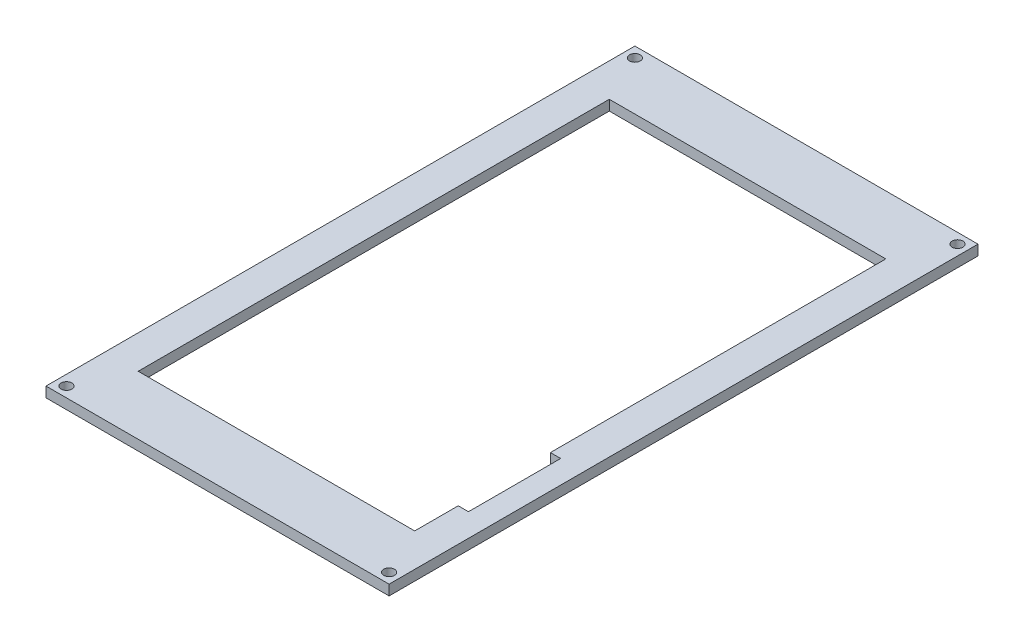
ISO-10303-21;
HEADER;
FILE_DESCRIPTION(('STEP AP214'),'2;1');
FILE_NAME('part.step','',(''),(''),'','','');
FILE_SCHEMA(('AUTOMOTIVE_DESIGN { 1 0 10303 214 1 1 1 1 }'));
ENDSEC;
DATA;
#1=APPLICATION_CONTEXT('core data for automotive mechanical design processes');
#2=APPLICATION_PROTOCOL_DEFINITION('international standard','automotive_design',2000,#1);
#3=PRODUCT_CONTEXT('',#1,'mechanical');
#4=PRODUCT('Part','Part','',(#3));
#5=PRODUCT_RELATED_PRODUCT_CATEGORY('part','',(#4));
#6=PRODUCT_DEFINITION_FORMATION('','',#4);
#7=PRODUCT_DEFINITION_CONTEXT('part definition',#1,'design');
#8=PRODUCT_DEFINITION('design','',#6,#7);
#9=PRODUCT_DEFINITION_SHAPE('','',#8);
#10=(LENGTH_UNIT() NAMED_UNIT(*) SI_UNIT(.MILLI.,.METRE.));
#11=(NAMED_UNIT(*) PLANE_ANGLE_UNIT() SI_UNIT($,.RADIAN.));
#12=(NAMED_UNIT(*) SI_UNIT($,.STERADIAN.) SOLID_ANGLE_UNIT());
#13=UNCERTAINTY_MEASURE_WITH_UNIT(LENGTH_MEASURE(1.E-05),#10,'distance_accuracy_value','');
#14=(GEOMETRIC_REPRESENTATION_CONTEXT(3) GLOBAL_UNCERTAINTY_ASSIGNED_CONTEXT((#13)) GLOBAL_UNIT_ASSIGNED_CONTEXT((#10,
#11,#12)) REPRESENTATION_CONTEXT('',''));
#15=CARTESIAN_POINT('',(0.,0.,0.));
#16=DIRECTION('',(0.,0.,1.));
#17=DIRECTION('',(1.,0.,0.));
#18=AXIS2_PLACEMENT_3D('',#15,#16,#17);
#19=CARTESIAN_POINT('',(67.,2.,0.));
#20=DIRECTION('',(1.,0.,0.));
#21=DIRECTION('',(0.,0.,-1.));
#22=AXIS2_PLACEMENT_3D('',#19,#20,#21);
#23=PLANE('',#22);
#24=DIRECTION('',(0.,0.,1.));
#25=VECTOR('',#24,1.);
#26=CARTESIAN_POINT('',(67.,0.,0.));
#27=LINE('',#26,#25);
#28=CARTESIAN_POINT('',(67.,0.,0.));
#29=VERTEX_POINT('',#28);
#30=CARTESIAN_POINT('',(67.,0.,115.));
#31=VERTEX_POINT('',#30);
#32=EDGE_CURVE('E216',#29,#31,#27,.T.);
#33=ORIENTED_EDGE('',*,*,#32,.F.);
#34=DIRECTION('',(0.,-1.,0.));
#35=VECTOR('',#34,1.);
#36=CARTESIAN_POINT('',(67.,2.,0.));
#37=LINE('',#36,#35);
#38=CARTESIAN_POINT('',(67.,2.,0.));
#39=VERTEX_POINT('',#38);
#40=EDGE_CURVE('E11',#39,#29,#37,.T.);
#41=ORIENTED_EDGE('',*,*,#40,.F.);
#42=DIRECTION('',(0.,0.,1.));
#43=VECTOR('',#42,1.);
#44=CARTESIAN_POINT('',(67.,2.,0.));
#45=LINE('',#44,#43);
#46=CARTESIAN_POINT('',(67.,2.,115.));
#47=VERTEX_POINT('',#46);
#48=EDGE_CURVE('E160',#39,#47,#45,.T.);
#49=ORIENTED_EDGE('',*,*,#48,.T.);
#50=DIRECTION('',(0.,-1.,0.));
#51=VECTOR('',#50,1.);
#52=CARTESIAN_POINT('',(67.,2.,115.));
#53=LINE('',#52,#51);
#54=EDGE_CURVE('E108',#47,#31,#53,.T.);
#55=ORIENTED_EDGE('',*,*,#54,.T.);
#56=EDGE_LOOP('',(#33,#41,#49,#55));
#57=FACE_BOUND('',#56,.T.);
#58=ADVANCED_FACE('F41',(#57),#23,.T.);
#59=CARTESIAN_POINT('',(0.,2.,0.));
#60=DIRECTION('',(0.,0.,-1.));
#61=DIRECTION('',(-1.,0.,0.));
#62=AXIS2_PLACEMENT_3D('',#59,#60,#61);
#63=PLANE('',#62);
#64=DIRECTION('',(1.,0.,0.));
#65=VECTOR('',#64,1.);
#66=CARTESIAN_POINT('',(0.,0.,0.));
#67=LINE('',#66,#65);
#68=CARTESIAN_POINT('',(0.,0.,0.));
#69=VERTEX_POINT('',#68);
#70=EDGE_CURVE('E148',#69,#29,#67,.T.);
#71=ORIENTED_EDGE('',*,*,#70,.F.);
#72=DIRECTION('',(0.,-1.,0.));
#73=VECTOR('',#72,1.);
#74=CARTESIAN_POINT('',(0.,2.,0.));
#75=LINE('',#74,#73);
#76=CARTESIAN_POINT('',(0.,2.,0.));
#77=VERTEX_POINT('',#76);
#78=EDGE_CURVE('E52',#77,#69,#75,.T.);
#79=ORIENTED_EDGE('',*,*,#78,.F.);
#80=DIRECTION('',(1.,0.,0.));
#81=VECTOR('',#80,1.);
#82=CARTESIAN_POINT('',(0.,2.,0.));
#83=LINE('',#82,#81);
#84=EDGE_CURVE('E146',#77,#39,#83,.T.);
#85=ORIENTED_EDGE('',*,*,#84,.T.);
#86=ORIENTED_EDGE('',*,*,#40,.T.);
#87=EDGE_LOOP('',(#71,#79,#85,#86));
#88=FACE_BOUND('',#87,.T.);
#89=ADVANCED_FACE('F144',(#88),#63,.T.);
#90=CARTESIAN_POINT('',(0.,2.,0.));
#91=DIRECTION('',(1.,0.,0.));
#92=DIRECTION('',(0.,0.,-1.));
#93=AXIS2_PLACEMENT_3D('',#90,#91,#92);
#94=PLANE('',#93);
#95=DIRECTION('',(0.,0.,1.));
#96=VECTOR('',#95,1.);
#97=CARTESIAN_POINT('',(0.,0.,0.));
#98=LINE('',#97,#96);
#99=CARTESIAN_POINT('',(0.,0.,115.));
#100=VERTEX_POINT('',#99);
#101=EDGE_CURVE('E221',#69,#100,#98,.T.);
#102=ORIENTED_EDGE('',*,*,#101,.T.);
#103=DIRECTION('',(0.,-1.,0.));
#104=VECTOR('',#103,1.);
#105=CARTESIAN_POINT('',(0.,2.,115.));
#106=LINE('',#105,#104);
#107=CARTESIAN_POINT('',(0.,2.,115.));
#108=VERTEX_POINT('',#107);
#109=EDGE_CURVE('E152',#108,#100,#106,.T.);
#110=ORIENTED_EDGE('',*,*,#109,.F.);
#111=DIRECTION('',(0.,0.,1.));
#112=VECTOR('',#111,1.);
#113=CARTESIAN_POINT('',(0.,2.,0.));
#114=LINE('',#113,#112);
#115=EDGE_CURVE('E155',#77,#108,#114,.T.);
#116=ORIENTED_EDGE('',*,*,#115,.F.);
#117=ORIENTED_EDGE('',*,*,#78,.T.);
#118=EDGE_LOOP('',(#102,#110,#116,#117));
#119=FACE_BOUND('',#118,.T.);
#120=ADVANCED_FACE('F156',(#119),#94,.F.);
#121=CARTESIAN_POINT('',(62.5,2.,0.));
#122=DIRECTION('',(-1.,0.,0.));
#123=DIRECTION('',(0.,0.,1.));
#124=AXIS2_PLACEMENT_3D('',#121,#122,#123);
#125=PLANE('',#124);
#126=DIRECTION('',(0.,0.,-1.));
#127=VECTOR('',#126,1.);
#128=CARTESIAN_POINT('',(62.5,0.,0.));
#129=LINE('',#128,#127);
#130=CARTESIAN_POINT('',(62.5,0.,95.));
#131=VERTEX_POINT('',#130);
#132=CARTESIAN_POINT('',(62.5,0.,77.));
#133=VERTEX_POINT('',#132);
#134=EDGE_CURVE('E187',#131,#133,#129,.T.);
#135=ORIENTED_EDGE('',*,*,#134,.F.);
#136=DIRECTION('',(0.,-1.,0.));
#137=VECTOR('',#136,1.);
#138=CARTESIAN_POINT('',(62.5,2.,95.));
#139=LINE('',#138,#137);
#140=CARTESIAN_POINT('',(62.5,2.,95.));
#141=VERTEX_POINT('',#140);
#142=EDGE_CURVE('E45',#141,#131,#139,.T.);
#143=ORIENTED_EDGE('',*,*,#142,.F.);
#144=DIRECTION('',(0.,0.,-1.));
#145=VECTOR('',#144,1.);
#146=CARTESIAN_POINT('',(62.5,2.,0.));
#147=LINE('',#146,#145);
#148=CARTESIAN_POINT('',(62.5,2.,77.));
#149=VERTEX_POINT('',#148);
#150=EDGE_CURVE('E301',#141,#149,#147,.T.);
#151=ORIENTED_EDGE('',*,*,#150,.T.);
#152=DIRECTION('',(0.,-1.,0.));
#153=VECTOR('',#152,1.);
#154=CARTESIAN_POINT('',(62.5,2.,77.));
#155=LINE('',#154,#153);
#156=EDGE_CURVE('E170',#149,#133,#155,.T.);
#157=ORIENTED_EDGE('',*,*,#156,.T.);
#158=EDGE_LOOP('',(#135,#143,#151,#157));
#159=FACE_BOUND('',#158,.T.);
#160=ADVANCED_FACE('F261',(#159),#125,.T.);
#161=CARTESIAN_POINT('',(0.,2.,95.));
#162=DIRECTION('',(0.,0.,-1.));
#163=DIRECTION('',(-1.,0.,0.));
#164=AXIS2_PLACEMENT_3D('',#161,#162,#163);
#165=PLANE('',#164);
#166=DIRECTION('',(1.,0.,0.));
#167=VECTOR('',#166,1.);
#168=CARTESIAN_POINT('',(0.,0.,95.));
#169=LINE('',#168,#167);
#170=CARTESIAN_POINT('',(60.5,0.,95.));
#171=VERTEX_POINT('',#170);
#172=EDGE_CURVE('E191',#171,#131,#169,.T.);
#173=ORIENTED_EDGE('',*,*,#172,.F.);
#174=DIRECTION('',(0.,-1.,0.));
#175=VECTOR('',#174,1.);
#176=CARTESIAN_POINT('',(60.5,2.,95.));
#177=LINE('',#176,#175);
#178=CARTESIAN_POINT('',(60.5,2.,95.));
#179=VERTEX_POINT('',#178);
#180=EDGE_CURVE('E249',#179,#171,#177,.T.);
#181=ORIENTED_EDGE('',*,*,#180,.F.);
#182=DIRECTION('',(1.,0.,0.));
#183=VECTOR('',#182,1.);
#184=CARTESIAN_POINT('',(0.,2.,95.));
#185=LINE('',#184,#183);
#186=EDGE_CURVE('E260',#179,#141,#185,.T.);
#187=ORIENTED_EDGE('',*,*,#186,.T.);
#188=ORIENTED_EDGE('',*,*,#142,.T.);
#189=EDGE_LOOP('',(#173,#181,#187,#188));
#190=FACE_BOUND('',#189,.T.);
#191=ADVANCED_FACE('F258',(#190),#165,.T.);
#192=CARTESIAN_POINT('',(60.5,2.,0.));
#193=DIRECTION('',(1.,0.,0.));
#194=DIRECTION('',(0.,0.,-1.));
#195=AXIS2_PLACEMENT_3D('',#192,#193,#194);
#196=PLANE('',#195);
#197=DIRECTION('',(0.,0.,1.));
#198=VECTOR('',#197,1.);
#199=CARTESIAN_POINT('',(60.5,0.,0.));
#200=LINE('',#199,#198);
#201=CARTESIAN_POINT('',(60.5,0.,103.5));
#202=VERTEX_POINT('',#201);
#203=EDGE_CURVE('E195',#171,#202,#200,.T.);
#204=ORIENTED_EDGE('',*,*,#203,.T.);
#205=DIRECTION('',(0.,-1.,0.));
#206=VECTOR('',#205,1.);
#207=CARTESIAN_POINT('',(60.5,2.,103.5));
#208=LINE('',#207,#206);
#209=CARTESIAN_POINT('',(60.5,2.,103.5));
#210=VERTEX_POINT('',#209);
#211=EDGE_CURVE('E247',#210,#202,#208,.T.);
#212=ORIENTED_EDGE('',*,*,#211,.F.);
#213=DIRECTION('',(0.,0.,1.));
#214=VECTOR('',#213,1.);
#215=CARTESIAN_POINT('',(60.5,2.,0.));
#216=LINE('',#215,#214);
#217=EDGE_CURVE('E269',#179,#210,#216,.T.);
#218=ORIENTED_EDGE('',*,*,#217,.F.);
#219=ORIENTED_EDGE('',*,*,#180,.T.);
#220=EDGE_LOOP('',(#204,#212,#218,#219));
#221=FACE_BOUND('',#220,.T.);
#222=ADVANCED_FACE('F267',(#221),#196,.F.);
#223=CARTESIAN_POINT('',(0.,2.,103.5));
#224=DIRECTION('',(0.,0.,-1.));
#225=DIRECTION('',(-1.,0.,0.));
#226=AXIS2_PLACEMENT_3D('',#223,#224,#225);
#227=PLANE('',#226);
#228=DIRECTION('',(1.,0.,0.));
#229=VECTOR('',#228,1.);
#230=CARTESIAN_POINT('',(0.,0.,103.5));
#231=LINE('',#230,#229);
#232=CARTESIAN_POINT('',(6.50000000000002,0.,103.5));
#233=VERTEX_POINT('',#232);
#234=EDGE_CURVE('E199',#233,#202,#231,.T.);
#235=ORIENTED_EDGE('',*,*,#234,.F.);
#236=DIRECTION('',(0.,-1.,0.));
#237=VECTOR('',#236,1.);
#238=CARTESIAN_POINT('',(6.50000000000002,2.,103.5));
#239=LINE('',#238,#237);
#240=CARTESIAN_POINT('',(6.50000000000002,2.,103.5));
#241=VERTEX_POINT('',#240);
#242=EDGE_CURVE('E244',#241,#233,#239,.T.);
#243=ORIENTED_EDGE('',*,*,#242,.F.);
#244=DIRECTION('',(1.,0.,0.));
#245=VECTOR('',#244,1.);
#246=CARTESIAN_POINT('',(0.,2.,103.5));
#247=LINE('',#246,#245);
#248=EDGE_CURVE('E272',#241,#210,#247,.T.);
#249=ORIENTED_EDGE('',*,*,#248,.T.);
#250=ORIENTED_EDGE('',*,*,#211,.T.);
#251=EDGE_LOOP('',(#235,#243,#249,#250));
#252=FACE_BOUND('',#251,.T.);
#253=ADVANCED_FACE('F273',(#252),#227,.T.);
#254=CARTESIAN_POINT('',(6.50000000000001,2.,0.));
#255=DIRECTION('',(1.,0.,0.));
#256=DIRECTION('',(0.,0.,-1.));
#257=AXIS2_PLACEMENT_3D('',#254,#255,#256);
#258=PLANE('',#257);
#259=DIRECTION('',(0.,0.,1.));
#260=VECTOR('',#259,1.);
#261=CARTESIAN_POINT('',(6.50000000000001,0.,0.));
#262=LINE('',#261,#260);
#263=CARTESIAN_POINT('',(6.50000000000001,0.,11.5));
#264=VERTEX_POINT('',#263);
#265=EDGE_CURVE('E204',#264,#233,#262,.T.);
#266=ORIENTED_EDGE('',*,*,#265,.F.);
#267=DIRECTION('',(0.,-1.,0.));
#268=VECTOR('',#267,1.);
#269=CARTESIAN_POINT('',(6.50000000000001,2.,11.5));
#270=LINE('',#269,#268);
#271=CARTESIAN_POINT('',(6.50000000000001,2.,11.5));
#272=VERTEX_POINT('',#271);
#273=EDGE_CURVE('E241',#272,#264,#270,.T.);
#274=ORIENTED_EDGE('',*,*,#273,.F.);
#275=DIRECTION('',(0.,0.,1.));
#276=VECTOR('',#275,1.);
#277=CARTESIAN_POINT('',(6.50000000000001,2.,0.));
#278=LINE('',#277,#276);
#279=EDGE_CURVE('E278',#272,#241,#278,.T.);
#280=ORIENTED_EDGE('',*,*,#279,.T.);
#281=ORIENTED_EDGE('',*,*,#242,.T.);
#282=EDGE_LOOP('',(#266,#274,#280,#281));
#283=FACE_BOUND('',#282,.T.);
#284=ADVANCED_FACE('F363',(#283),#258,.T.);
#285=CARTESIAN_POINT('',(0.,2.,11.5));
#286=DIRECTION('',(0.,0.,-1.));
#287=DIRECTION('',(-1.,0.,0.));
#288=AXIS2_PLACEMENT_3D('',#285,#286,#287);
#289=PLANE('',#288);
#290=DIRECTION('',(1.,0.,0.));
#291=VECTOR('',#290,1.);
#292=CARTESIAN_POINT('',(0.,0.,11.5));
#293=LINE('',#292,#291);
#294=CARTESIAN_POINT('',(60.5,0.,11.5));
#295=VERTEX_POINT('',#294);
#296=EDGE_CURVE('E208',#264,#295,#293,.T.);
#297=ORIENTED_EDGE('',*,*,#296,.T.);
#298=DIRECTION('',(0.,-1.,0.));
#299=VECTOR('',#298,1.);
#300=CARTESIAN_POINT('',(60.5,2.,11.5));
#301=LINE('',#300,#299);
#302=CARTESIAN_POINT('',(60.5,2.,11.5));
#303=VERTEX_POINT('',#302);
#304=EDGE_CURVE('E237',#303,#295,#301,.T.);
#305=ORIENTED_EDGE('',*,*,#304,.F.);
#306=DIRECTION('',(1.,0.,0.));
#307=VECTOR('',#306,1.);
#308=CARTESIAN_POINT('',(0.,2.,11.5));
#309=LINE('',#308,#307);
#310=EDGE_CURVE('E282',#272,#303,#309,.T.);
#311=ORIENTED_EDGE('',*,*,#310,.F.);
#312=ORIENTED_EDGE('',*,*,#273,.T.);
#313=EDGE_LOOP('',(#297,#305,#311,#312));
#314=FACE_BOUND('',#313,.T.);
#315=ADVANCED_FACE('F360',(#314),#289,.F.);
#316=CARTESIAN_POINT('',(60.5,0.,77.));
#317=VERTEX_POINT('',#316);
#318=EDGE_CURVE('E200',#295,#317,#200,.T.);
#319=ORIENTED_EDGE('',*,*,#318,.T.);
#320=DIRECTION('',(0.,-1.,0.));
#321=VECTOR('',#320,1.);
#322=CARTESIAN_POINT('',(60.5,2.,77.));
#323=LINE('',#322,#321);
#324=CARTESIAN_POINT('',(60.5,2.,77.));
#325=VERTEX_POINT('',#324);
#326=EDGE_CURVE('E233',#325,#317,#323,.T.);
#327=ORIENTED_EDGE('',*,*,#326,.F.);
#328=EDGE_CURVE('E285',#303,#325,#216,.T.);
#329=ORIENTED_EDGE('',*,*,#328,.F.);
#330=ORIENTED_EDGE('',*,*,#304,.T.);
#331=EDGE_LOOP('',(#319,#327,#329,#330));
#332=FACE_BOUND('',#331,.T.);
#333=ADVANCED_FACE('F298',(#332),#196,.F.);
#334=CARTESIAN_POINT('',(0.,2.,77.));
#335=DIRECTION('',(0.,0.,-1.));
#336=DIRECTION('',(-1.,0.,0.));
#337=AXIS2_PLACEMENT_3D('',#334,#335,#336);
#338=PLANE('',#337);
#339=DIRECTION('',(1.,0.,0.));
#340=VECTOR('',#339,1.);
#341=CARTESIAN_POINT('',(0.,0.,77.));
#342=LINE('',#341,#340);
#343=EDGE_CURVE('E212',#317,#133,#342,.T.);
#344=ORIENTED_EDGE('',*,*,#343,.T.);
#345=ORIENTED_EDGE('',*,*,#156,.F.);
#346=DIRECTION('',(1.,0.,0.));
#347=VECTOR('',#346,1.);
#348=CARTESIAN_POINT('',(0.,2.,77.));
#349=LINE('',#348,#347);
#350=EDGE_CURVE('E164',#325,#149,#349,.T.);
#351=ORIENTED_EDGE('',*,*,#350,.F.);
#352=ORIENTED_EDGE('',*,*,#326,.T.);
#353=EDGE_LOOP('',(#344,#345,#351,#352));
#354=FACE_BOUND('',#353,.T.);
#355=ADVANCED_FACE('F300',(#354),#338,.F.);
#356=CARTESIAN_POINT('',(2.,2.,2.));
#357=DIRECTION('',(0.,-1.,0.));
#358=DIRECTION('',(0.,0.,-1.));
#359=AXIS2_PLACEMENT_3D('',#356,#357,#358);
#360=CYLINDRICAL_SURFACE('',#359,1.05);
#361=CARTESIAN_POINT('',(2.,2.,2.));
#362=DIRECTION('',(0.,1.,0.));
#363=DIRECTION('',(0.,0.,1.));
#364=AXIS2_PLACEMENT_3D('',#361,#362,#363);
#365=CIRCLE('',#364,1.05);
#366=CARTESIAN_POINT('',(2.,2.,3.05));
#367=VERTEX_POINT('',#366);
#368=EDGE_CURVE('E303',#367,#367,#365,.T.);
#369=ORIENTED_EDGE('',*,*,#368,.T.);
#370=EDGE_LOOP('',(#369));
#371=FACE_BOUND('',#370,.T.);
#372=CARTESIAN_POINT('',(2.,0.,2.));
#373=DIRECTION('',(0.,1.,0.));
#374=DIRECTION('',(0.,0.,1.));
#375=AXIS2_PLACEMENT_3D('',#372,#373,#374);
#376=CIRCLE('',#375,1.05);
#377=CARTESIAN_POINT('',(2.,0.,3.05));
#378=VERTEX_POINT('',#377);
#379=EDGE_CURVE('E183',#378,#378,#376,.T.);
#380=ORIENTED_EDGE('',*,*,#379,.F.);
#381=EDGE_LOOP('',(#380));
#382=FACE_BOUND('',#381,.T.);
#383=ADVANCED_FACE('F334',(#371,#382),#360,.F.);
#384=CARTESIAN_POINT('',(65.,2.,2.));
#385=DIRECTION('',(0.,-1.,0.));
#386=DIRECTION('',(0.,0.,-1.));
#387=AXIS2_PLACEMENT_3D('',#384,#385,#386);
#388=CYLINDRICAL_SURFACE('',#387,1.04999999999999);
#389=CARTESIAN_POINT('',(65.,2.,2.));
#390=DIRECTION('',(0.,1.,0.));
#391=DIRECTION('',(0.,0.,1.));
#392=AXIS2_PLACEMENT_3D('',#389,#390,#391);
#393=CIRCLE('',#392,1.04999999999999);
#394=CARTESIAN_POINT('',(65.,2.,3.04999999999999));
#395=VERTEX_POINT('',#394);
#396=EDGE_CURVE('E308',#395,#395,#393,.T.);
#397=ORIENTED_EDGE('',*,*,#396,.T.);
#398=EDGE_LOOP('',(#397));
#399=FACE_BOUND('',#398,.T.);
#400=CARTESIAN_POINT('',(65.,0.,2.));
#401=DIRECTION('',(0.,1.,0.));
#402=DIRECTION('',(0.,0.,1.));
#403=AXIS2_PLACEMENT_3D('',#400,#401,#402);
#404=CIRCLE('',#403,1.04999999999999);
#405=CARTESIAN_POINT('',(65.,0.,3.04999999999999));
#406=VERTEX_POINT('',#405);
#407=EDGE_CURVE('E179',#406,#406,#404,.T.);
#408=ORIENTED_EDGE('',*,*,#407,.F.);
#409=EDGE_LOOP('',(#408));
#410=FACE_BOUND('',#409,.T.);
#411=ADVANCED_FACE('F337',(#399,#410),#388,.F.);
#412=CARTESIAN_POINT('',(2.00000000000001,2.,113.));
#413=DIRECTION('',(0.,-1.,0.));
#414=DIRECTION('',(0.,0.,-1.));
#415=AXIS2_PLACEMENT_3D('',#412,#413,#414);
#416=CYLINDRICAL_SURFACE('',#415,1.05);
#417=CARTESIAN_POINT('',(2.00000000000001,2.,113.));
#418=DIRECTION('',(0.,1.,0.));
#419=DIRECTION('',(0.,0.,1.));
#420=AXIS2_PLACEMENT_3D('',#417,#418,#419);
#421=CIRCLE('',#420,1.05);
#422=CARTESIAN_POINT('',(2.00000000000001,2.,114.05));
#423=VERTEX_POINT('',#422);
#424=EDGE_CURVE('E314',#423,#423,#421,.T.);
#425=ORIENTED_EDGE('',*,*,#424,.T.);
#426=EDGE_LOOP('',(#425));
#427=FACE_BOUND('',#426,.T.);
#428=CARTESIAN_POINT('',(2.00000000000001,0.,113.));
#429=DIRECTION('',(0.,1.,0.));
#430=DIRECTION('',(0.,0.,1.));
#431=AXIS2_PLACEMENT_3D('',#428,#429,#430);
#432=CIRCLE('',#431,1.05);
#433=CARTESIAN_POINT('',(2.00000000000001,0.,114.05));
#434=VERTEX_POINT('',#433);
#435=EDGE_CURVE('E175',#434,#434,#432,.T.);
#436=ORIENTED_EDGE('',*,*,#435,.F.);
#437=EDGE_LOOP('',(#436));
#438=FACE_BOUND('',#437,.T.);
#439=ADVANCED_FACE('F375',(#427,#438),#416,.F.);
#440=CARTESIAN_POINT('',(65.,2.,113.));
#441=DIRECTION('',(0.,-1.,0.));
#442=DIRECTION('',(0.,0.,-1.));
#443=AXIS2_PLACEMENT_3D('',#440,#441,#442);
#444=CYLINDRICAL_SURFACE('',#443,1.04999999999999);
#445=CARTESIAN_POINT('',(65.,2.,113.));
#446=DIRECTION('',(0.,1.,0.));
#447=DIRECTION('',(0.,0.,1.));
#448=AXIS2_PLACEMENT_3D('',#445,#446,#447);
#449=CIRCLE('',#448,1.04999999999999);
#450=CARTESIAN_POINT('',(65.,2.,114.05));
#451=VERTEX_POINT('',#450);
#452=EDGE_CURVE('E226',#451,#451,#449,.T.);
#453=ORIENTED_EDGE('',*,*,#452,.T.);
#454=EDGE_LOOP('',(#453));
#455=FACE_BOUND('',#454,.T.);
#456=CARTESIAN_POINT('',(65.,0.,113.));
#457=DIRECTION('',(0.,1.,0.));
#458=DIRECTION('',(0.,0.,1.));
#459=AXIS2_PLACEMENT_3D('',#456,#457,#458);
#460=CIRCLE('',#459,1.04999999999999);
#461=CARTESIAN_POINT('',(65.,0.,114.05));
#462=VERTEX_POINT('',#461);
#463=EDGE_CURVE('E171',#462,#462,#460,.T.);
#464=ORIENTED_EDGE('',*,*,#463,.F.);
#465=EDGE_LOOP('',(#464));
#466=FACE_BOUND('',#465,.T.);
#467=ADVANCED_FACE('F43',(#455,#466),#444,.F.);
#468=CARTESIAN_POINT('',(0.,2.,115.));
#469=DIRECTION('',(0.,0.,-1.));
#470=DIRECTION('',(-1.,0.,0.));
#471=AXIS2_PLACEMENT_3D('',#468,#469,#470);
#472=PLANE('',#471);
#473=DIRECTION('',(1.,0.,0.));
#474=VECTOR('',#473,1.);
#475=CARTESIAN_POINT('',(0.,0.,115.));
#476=LINE('',#475,#474);
#477=EDGE_CURVE('E101',#100,#31,#476,.T.);
#478=ORIENTED_EDGE('',*,*,#477,.T.);
#479=ORIENTED_EDGE('',*,*,#54,.F.);
#480=DIRECTION('',(1.,0.,0.));
#481=VECTOR('',#480,1.);
#482=CARTESIAN_POINT('',(0.,2.,115.));
#483=LINE('',#482,#481);
#484=EDGE_CURVE('E61',#108,#47,#483,.T.);
#485=ORIENTED_EDGE('',*,*,#484,.F.);
#486=ORIENTED_EDGE('',*,*,#109,.T.);
#487=EDGE_LOOP('',(#478,#479,#485,#486));
#488=FACE_BOUND('',#487,.T.);
#489=ADVANCED_FACE('F326',(#488),#472,.F.);
#490=CARTESIAN_POINT('',(0.,2.,0.));
#491=DIRECTION('',(0.,1.,0.));
#492=DIRECTION('',(0.,0.,1.));
#493=AXIS2_PLACEMENT_3D('',#490,#491,#492);
#494=PLANE('',#493);
#495=ORIENTED_EDGE('',*,*,#452,.F.);
#496=EDGE_LOOP('',(#495));
#497=FACE_BOUND('',#496,.T.);
#498=ORIENTED_EDGE('',*,*,#424,.F.);
#499=EDGE_LOOP('',(#498));
#500=FACE_BOUND('',#499,.T.);
#501=ORIENTED_EDGE('',*,*,#396,.F.);
#502=EDGE_LOOP('',(#501));
#503=FACE_BOUND('',#502,.T.);
#504=ORIENTED_EDGE('',*,*,#368,.F.);
#505=EDGE_LOOP('',(#504));
#506=FACE_BOUND('',#505,.T.);
#507=ORIENTED_EDGE('',*,*,#150,.F.);
#508=ORIENTED_EDGE('',*,*,#186,.F.);
#509=ORIENTED_EDGE('',*,*,#217,.T.);
#510=ORIENTED_EDGE('',*,*,#248,.F.);
#511=ORIENTED_EDGE('',*,*,#279,.F.);
#512=ORIENTED_EDGE('',*,*,#310,.T.);
#513=ORIENTED_EDGE('',*,*,#328,.T.);
#514=ORIENTED_EDGE('',*,*,#350,.T.);
#515=EDGE_LOOP('',(#507,#508,#509,#510,#511,#512,#513,#514));
#516=FACE_BOUND('',#515,.T.);
#517=ORIENTED_EDGE('',*,*,#48,.F.);
#518=ORIENTED_EDGE('',*,*,#84,.F.);
#519=ORIENTED_EDGE('',*,*,#115,.T.);
#520=ORIENTED_EDGE('',*,*,#484,.T.);
#521=EDGE_LOOP('',(#517,#518,#519,#520));
#522=FACE_BOUND('',#521,.T.);
#523=ADVANCED_FACE('F159',(#497,#500,#503,#506,#516,#522),#494,.T.);
#524=CARTESIAN_POINT('',(0.,0.,0.));
#525=DIRECTION('',(0.,1.,0.));
#526=DIRECTION('',(0.,0.,1.));
#527=AXIS2_PLACEMENT_3D('',#524,#525,#526);
#528=PLANE('',#527);
#529=ORIENTED_EDGE('',*,*,#463,.T.);
#530=EDGE_LOOP('',(#529));
#531=FACE_BOUND('',#530,.T.);
#532=ORIENTED_EDGE('',*,*,#435,.T.);
#533=EDGE_LOOP('',(#532));
#534=FACE_BOUND('',#533,.T.);
#535=ORIENTED_EDGE('',*,*,#407,.T.);
#536=EDGE_LOOP('',(#535));
#537=FACE_BOUND('',#536,.T.);
#538=ORIENTED_EDGE('',*,*,#379,.T.);
#539=EDGE_LOOP('',(#538));
#540=FACE_BOUND('',#539,.T.);
#541=ORIENTED_EDGE('',*,*,#134,.T.);
#542=ORIENTED_EDGE('',*,*,#343,.F.);
#543=ORIENTED_EDGE('',*,*,#318,.F.);
#544=ORIENTED_EDGE('',*,*,#296,.F.);
#545=ORIENTED_EDGE('',*,*,#265,.T.);
#546=ORIENTED_EDGE('',*,*,#234,.T.);
#547=ORIENTED_EDGE('',*,*,#203,.F.);
#548=ORIENTED_EDGE('',*,*,#172,.T.);
#549=EDGE_LOOP('',(#541,#542,#543,#544,#545,#546,#547,#548));
#550=FACE_BOUND('',#549,.T.);
#551=ORIENTED_EDGE('',*,*,#32,.T.);
#552=ORIENTED_EDGE('',*,*,#477,.F.);
#553=ORIENTED_EDGE('',*,*,#101,.F.);
#554=ORIENTED_EDGE('',*,*,#70,.T.);
#555=EDGE_LOOP('',(#551,#552,#553,#554));
#556=FACE_BOUND('',#555,.T.);
#557=ADVANCED_FACE('F264',(#531,#534,#537,#540,#550,#556),#528,.F.);
#558=CLOSED_SHELL('',(#58,#89,#120,#160,#191,#222,#253,#284,#315,#333,#355,#383,#411,#439,#467,
#489,#523,#557));
#559=MANIFOLD_SOLID_BREP('B2',#558);
#560=ADVANCED_BREP_SHAPE_REPRESENTATION('',(#18,#559),#14);
#561=SHAPE_DEFINITION_REPRESENTATION(#9,#560);
ENDSEC;
END-ISO-10303-21;
